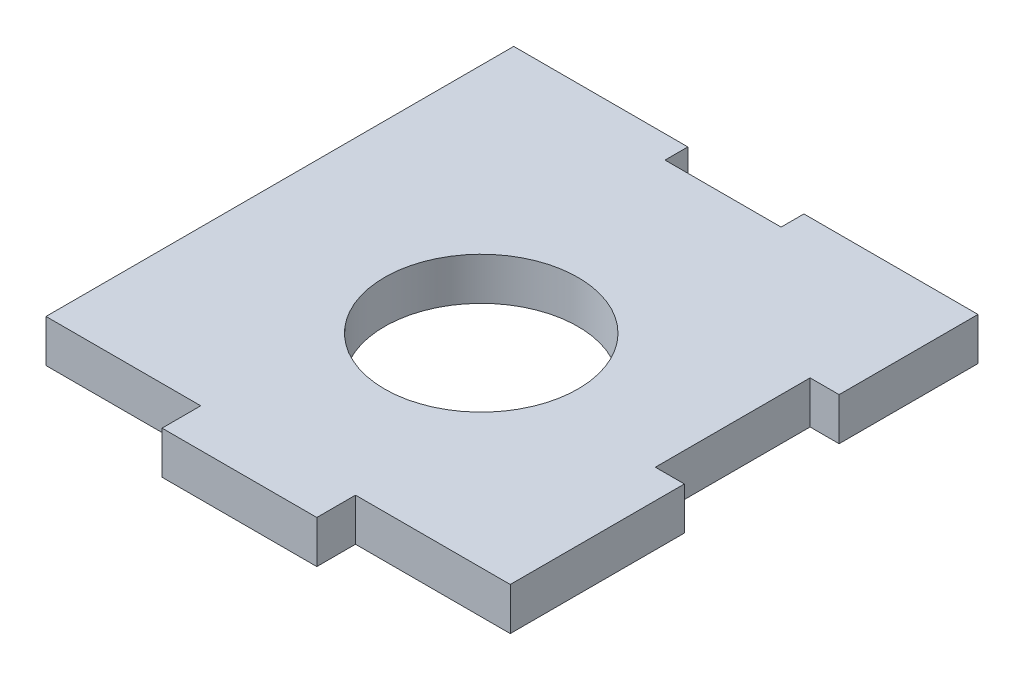
ISO-10303-21;
HEADER;
FILE_DESCRIPTION(('STEP AP214'),'2;1');
FILE_NAME('part.step','',(''),(''),'','','');
FILE_SCHEMA(('AUTOMOTIVE_DESIGN { 1 0 10303 214 1 1 1 1 }'));
ENDSEC;
DATA;
#1=APPLICATION_CONTEXT('core data for automotive mechanical design processes');
#2=APPLICATION_PROTOCOL_DEFINITION('international standard','automotive_design',2000,#1);
#3=PRODUCT_CONTEXT('',#1,'mechanical');
#4=PRODUCT('Part','Part','',(#3));
#5=PRODUCT_RELATED_PRODUCT_CATEGORY('part','',(#4));
#6=PRODUCT_DEFINITION_FORMATION('','',#4);
#7=PRODUCT_DEFINITION_CONTEXT('part definition',#1,'design');
#8=PRODUCT_DEFINITION('design','',#6,#7);
#9=PRODUCT_DEFINITION_SHAPE('','',#8);
#10=(LENGTH_UNIT() NAMED_UNIT(*) SI_UNIT(.MILLI.,.METRE.));
#11=(NAMED_UNIT(*) PLANE_ANGLE_UNIT() SI_UNIT($,.RADIAN.));
#12=(NAMED_UNIT(*) SI_UNIT($,.STERADIAN.) SOLID_ANGLE_UNIT());
#13=UNCERTAINTY_MEASURE_WITH_UNIT(LENGTH_MEASURE(1.E-05),#10,'distance_accuracy_value','');
#14=(GEOMETRIC_REPRESENTATION_CONTEXT(3) GLOBAL_UNCERTAINTY_ASSIGNED_CONTEXT((#13)) GLOBAL_UNIT_ASSIGNED_CONTEXT((#10,
#11,#12)) REPRESENTATION_CONTEXT('',''));
#15=CARTESIAN_POINT('',(0.,0.,0.));
#16=DIRECTION('',(0.,0.,1.));
#17=DIRECTION('',(1.,0.,0.));
#18=AXIS2_PLACEMENT_3D('',#15,#16,#17);
#19=CARTESIAN_POINT('',(0.,2.2,-30.3295211927794));
#20=DIRECTION('',(0.,0.,1.));
#21=DIRECTION('',(1.,0.,0.));
#22=AXIS2_PLACEMENT_3D('',#19,#20,#21);
#23=PLANE('',#22);
#24=DIRECTION('',(-1.,0.,0.));
#25=VECTOR('',#24,1.);
#26=CARTESIAN_POINT('',(0.,0.,-30.3295211927794));
#27=LINE('',#26,#25);
#28=CARTESIAN_POINT('',(-138.536383045774,0.,-30.3295211927794));
#29=VERTEX_POINT('',#28);
#30=CARTESIAN_POINT('',(-140.036383045781,0.,-30.3295211927794));
#31=VERTEX_POINT('',#30);
#32=EDGE_CURVE('E185',#29,#31,#27,.T.);
#33=ORIENTED_EDGE('',*,*,#32,.F.);
#34=DIRECTION('',(0.,-1.,0.));
#35=VECTOR('',#34,1.);
#36=CARTESIAN_POINT('',(-138.536383045774,2.2,-30.3295211927794));
#37=LINE('',#36,#35);
#38=CARTESIAN_POINT('',(-138.536383045774,2.2,-30.3295211927794));
#39=VERTEX_POINT('',#38);
#40=EDGE_CURVE('E11',#39,#29,#37,.T.);
#41=ORIENTED_EDGE('',*,*,#40,.F.);
#42=DIRECTION('',(-1.,0.,0.));
#43=VECTOR('',#42,1.);
#44=CARTESIAN_POINT('',(0.,2.2,-30.3295211927794));
#45=LINE('',#44,#43);
#46=CARTESIAN_POINT('',(-140.036383045781,2.2,-30.3295211927794));
#47=VERTEX_POINT('',#46);
#48=EDGE_CURVE('E274',#39,#47,#45,.T.);
#49=ORIENTED_EDGE('',*,*,#48,.T.);
#50=DIRECTION('',(0.,-1.,0.));
#51=VECTOR('',#50,1.);
#52=CARTESIAN_POINT('',(-140.036383045781,2.2,-30.3295211927794));
#53=LINE('',#52,#51);
#54=EDGE_CURVE('E54',#47,#31,#53,.T.);
#55=ORIENTED_EDGE('',*,*,#54,.T.);
#56=EDGE_LOOP('',(#33,#41,#49,#55));
#57=FACE_BOUND('',#56,.T.);
#58=ADVANCED_FACE('F37',(#57),#23,.T.);
#59=CARTESIAN_POINT('',(-138.536383045774,2.2,0.));
#60=DIRECTION('',(-1.,0.,0.));
#61=DIRECTION('',(0.,0.,1.));
#62=AXIS2_PLACEMENT_3D('',#59,#60,#61);
#63=PLANE('',#62);
#64=DIRECTION('',(0.,0.,-1.));
#65=VECTOR('',#64,1.);
#66=CARTESIAN_POINT('',(-138.536383045774,0.,0.));
#67=LINE('',#66,#65);
#68=CARTESIAN_POINT('',(-138.536383045774,0.,-37.5095211927366));
#69=VERTEX_POINT('',#68);
#70=EDGE_CURVE('E187',#29,#69,#67,.T.);
#71=ORIENTED_EDGE('',*,*,#70,.T.);
#72=DIRECTION('',(0.,-1.,0.));
#73=VECTOR('',#72,1.);
#74=CARTESIAN_POINT('',(-138.536383045774,2.2,-37.5095211927366));
#75=LINE('',#74,#73);
#76=CARTESIAN_POINT('',(-138.536383045774,2.2,-37.5095211927366));
#77=VERTEX_POINT('',#76);
#78=EDGE_CURVE('E46',#77,#69,#75,.T.);
#79=ORIENTED_EDGE('',*,*,#78,.F.);
#80=DIRECTION('',(0.,0.,-1.));
#81=VECTOR('',#80,1.);
#82=CARTESIAN_POINT('',(-138.536383045774,2.2,0.));
#83=LINE('',#82,#81);
#84=EDGE_CURVE('E165',#39,#77,#83,.T.);
#85=ORIENTED_EDGE('',*,*,#84,.F.);
#86=ORIENTED_EDGE('',*,*,#40,.T.);
#87=EDGE_LOOP('',(#71,#79,#85,#86));
#88=FACE_BOUND('',#87,.T.);
#89=ADVANCED_FACE('F261',(#88),#63,.F.);
#90=CARTESIAN_POINT('',(0.,2.2,-37.5095211927366));
#91=DIRECTION('',(0.,0.,-1.));
#92=DIRECTION('',(-1.,0.,0.));
#93=AXIS2_PLACEMENT_3D('',#90,#91,#92);
#94=PLANE('',#93);
#95=DIRECTION('',(1.,0.,0.));
#96=VECTOR('',#95,1.);
#97=CARTESIAN_POINT('',(0.,0.,-37.5095211927366));
#98=LINE('',#97,#96);
#99=CARTESIAN_POINT('',(-147.536383045791,0.,-37.5095211927366));
#100=VERTEX_POINT('',#99);
#101=EDGE_CURVE('E190',#100,#69,#98,.T.);
#102=ORIENTED_EDGE('',*,*,#101,.F.);
#103=DIRECTION('',(0.,-1.,0.));
#104=VECTOR('',#103,1.);
#105=CARTESIAN_POINT('',(-147.536383045791,2.2,-37.5095211927366));
#106=LINE('',#105,#104);
#107=CARTESIAN_POINT('',(-147.536383045791,2.2,-37.5095211927366));
#108=VERTEX_POINT('',#107);
#109=EDGE_CURVE('E251',#108,#100,#106,.T.);
#110=ORIENTED_EDGE('',*,*,#109,.F.);
#111=DIRECTION('',(1.,0.,0.));
#112=VECTOR('',#111,1.);
#113=CARTESIAN_POINT('',(0.,2.2,-37.5095211927366));
#114=LINE('',#113,#112);
#115=EDGE_CURVE('E258',#108,#77,#114,.T.);
#116=ORIENTED_EDGE('',*,*,#115,.T.);
#117=ORIENTED_EDGE('',*,*,#78,.T.);
#118=EDGE_LOOP('',(#102,#110,#116,#117));
#119=FACE_BOUND('',#118,.T.);
#120=ADVANCED_FACE('F256',(#119),#94,.T.);
#121=CARTESIAN_POINT('',(-147.536383045791,2.2,0.));
#122=DIRECTION('',(1.,0.,0.));
#123=DIRECTION('',(0.,0.,-1.));
#124=AXIS2_PLACEMENT_3D('',#121,#122,#123);
#125=PLANE('',#124);
#126=DIRECTION('',(0.,0.,1.));
#127=VECTOR('',#126,1.);
#128=CARTESIAN_POINT('',(-147.536383045791,0.,0.));
#129=LINE('',#128,#127);
#130=CARTESIAN_POINT('',(-147.536383045791,0.,-36.3295211926924));
#131=VERTEX_POINT('',#130);
#132=EDGE_CURVE('E193',#100,#131,#129,.T.);
#133=ORIENTED_EDGE('',*,*,#132,.T.);
#134=DIRECTION('',(0.,-1.,0.));
#135=VECTOR('',#134,1.);
#136=CARTESIAN_POINT('',(-147.536383045791,2.2,-36.3295211926924));
#137=LINE('',#136,#135);
#138=CARTESIAN_POINT('',(-147.536383045791,2.2,-36.3295211926924));
#139=VERTEX_POINT('',#138);
#140=EDGE_CURVE('E248',#139,#131,#137,.T.);
#141=ORIENTED_EDGE('',*,*,#140,.F.);
#142=DIRECTION('',(0.,0.,1.));
#143=VECTOR('',#142,1.);
#144=CARTESIAN_POINT('',(-147.536383045791,2.2,0.));
#145=LINE('',#144,#143);
#146=EDGE_CURVE('E270',#108,#139,#145,.T.);
#147=ORIENTED_EDGE('',*,*,#146,.F.);
#148=ORIENTED_EDGE('',*,*,#109,.T.);
#149=EDGE_LOOP('',(#133,#141,#147,#148));
#150=FACE_BOUND('',#149,.T.);
#151=ADVANCED_FACE('F267',(#150),#125,.F.);
#152=CARTESIAN_POINT('',(0.,2.2,-36.3295211926924));
#153=DIRECTION('',(0.,0.,1.));
#154=DIRECTION('',(1.,0.,0.));
#155=AXIS2_PLACEMENT_3D('',#152,#153,#154);
#156=PLANE('',#155);
#157=DIRECTION('',(-1.,0.,0.));
#158=VECTOR('',#157,1.);
#159=CARTESIAN_POINT('',(0.,0.,-36.3295211926924));
#160=LINE('',#159,#158);
#161=CARTESIAN_POINT('',(-153.536383045792,0.,-36.3295211926924));
#162=VERTEX_POINT('',#161);
#163=EDGE_CURVE('E196',#131,#162,#160,.T.);
#164=ORIENTED_EDGE('',*,*,#163,.T.);
#165=DIRECTION('',(0.,-1.,0.));
#166=VECTOR('',#165,1.);
#167=CARTESIAN_POINT('',(-153.536383045792,2.2,-36.3295211926924));
#168=LINE('',#167,#166);
#169=CARTESIAN_POINT('',(-153.536383045792,2.2,-36.3295211926924));
#170=VERTEX_POINT('',#169);
#171=EDGE_CURVE('E246',#170,#162,#168,.T.);
#172=ORIENTED_EDGE('',*,*,#171,.F.);
#173=DIRECTION('',(-1.,0.,0.));
#174=VECTOR('',#173,1.);
#175=CARTESIAN_POINT('',(0.,2.2,-36.3295211926924));
#176=LINE('',#175,#174);
#177=EDGE_CURVE('E271',#139,#170,#176,.T.);
#178=ORIENTED_EDGE('',*,*,#177,.F.);
#179=ORIENTED_EDGE('',*,*,#140,.T.);
#180=EDGE_LOOP('',(#164,#172,#178,#179));
#181=FACE_BOUND('',#180,.T.);
#182=ADVANCED_FACE('F323',(#181),#156,.F.);
#183=CARTESIAN_POINT('',(-153.536383045792,2.2,0.));
#184=DIRECTION('',(1.,0.,0.));
#185=DIRECTION('',(0.,0.,-1.));
#186=AXIS2_PLACEMENT_3D('',#183,#184,#185);
#187=PLANE('',#186);
#188=DIRECTION('',(0.,0.,1.));
#189=VECTOR('',#188,1.);
#190=CARTESIAN_POINT('',(-153.536383045792,0.,0.));
#191=LINE('',#190,#189);
#192=CARTESIAN_POINT('',(-153.536383045792,0.,-37.5095211927366));
#193=VERTEX_POINT('',#192);
#194=EDGE_CURVE('E199',#193,#162,#191,.T.);
#195=ORIENTED_EDGE('',*,*,#194,.F.);
#196=DIRECTION('',(0.,-1.,0.));
#197=VECTOR('',#196,1.);
#198=CARTESIAN_POINT('',(-153.536383045792,2.2,-37.5095211927366));
#199=LINE('',#198,#197);
#200=CARTESIAN_POINT('',(-153.536383045792,2.2,-37.5095211927366));
#201=VERTEX_POINT('',#200);
#202=EDGE_CURVE('E244',#201,#193,#199,.T.);
#203=ORIENTED_EDGE('',*,*,#202,.F.);
#204=DIRECTION('',(0.,0.,1.));
#205=VECTOR('',#204,1.);
#206=CARTESIAN_POINT('',(-153.536383045792,2.2,0.));
#207=LINE('',#206,#205);
#208=EDGE_CURVE('E278',#201,#170,#207,.T.);
#209=ORIENTED_EDGE('',*,*,#208,.T.);
#210=ORIENTED_EDGE('',*,*,#171,.T.);
#211=EDGE_LOOP('',(#195,#203,#209,#210));
#212=FACE_BOUND('',#211,.T.);
#213=ADVANCED_FACE('F326',(#212),#187,.T.);
#214=CARTESIAN_POINT('',(0.,2.2,-37.5095211927366));
#215=DIRECTION('',(0.,0.,-1.));
#216=DIRECTION('',(-1.,0.,0.));
#217=AXIS2_PLACEMENT_3D('',#214,#215,#216);
#218=PLANE('',#217);
#219=DIRECTION('',(1.,0.,0.));
#220=VECTOR('',#219,1.);
#221=CARTESIAN_POINT('',(0.,0.,-37.5095211927366));
#222=LINE('',#221,#220);
#223=CARTESIAN_POINT('',(-162.536383045789,0.,-37.5095211927366));
#224=VERTEX_POINT('',#223);
#225=EDGE_CURVE('E202',#224,#193,#222,.T.);
#226=ORIENTED_EDGE('',*,*,#225,.F.);
#227=DIRECTION('',(0.,-1.,0.));
#228=VECTOR('',#227,1.);
#229=CARTESIAN_POINT('',(-162.536383045789,2.2,-37.5095211927366));
#230=LINE('',#229,#228);
#231=CARTESIAN_POINT('',(-162.536383045789,2.2,-37.5095211927366));
#232=VERTEX_POINT('',#231);
#233=EDGE_CURVE('E242',#232,#224,#230,.T.);
#234=ORIENTED_EDGE('',*,*,#233,.F.);
#235=DIRECTION('',(1.,0.,0.));
#236=VECTOR('',#235,1.);
#237=CARTESIAN_POINT('',(0.,2.2,-37.5095211927366));
#238=LINE('',#237,#236);
#239=EDGE_CURVE('E281',#232,#201,#238,.T.);
#240=ORIENTED_EDGE('',*,*,#239,.T.);
#241=ORIENTED_EDGE('',*,*,#202,.T.);
#242=EDGE_LOOP('',(#226,#234,#240,#241));
#243=FACE_BOUND('',#242,.T.);
#244=ADVANCED_FACE('F330',(#243),#218,.T.);
#245=CARTESIAN_POINT('',(-162.536383045789,2.2,0.));
#246=DIRECTION('',(1.,0.,0.));
#247=DIRECTION('',(0.,0.,-1.));
#248=AXIS2_PLACEMENT_3D('',#245,#246,#247);
#249=PLANE('',#248);
#250=DIRECTION('',(0.,0.,1.));
#251=VECTOR('',#250,1.);
#252=CARTESIAN_POINT('',(-162.536383045789,0.,0.));
#253=LINE('',#252,#251);
#254=CARTESIAN_POINT('',(-162.536383045789,0.,-13.3295211927798));
#255=VERTEX_POINT('',#254);
#256=EDGE_CURVE('E205',#224,#255,#253,.T.);
#257=ORIENTED_EDGE('',*,*,#256,.T.);
#258=DIRECTION('',(0.,-1.,0.));
#259=VECTOR('',#258,1.);
#260=CARTESIAN_POINT('',(-162.536383045789,2.2,-13.3295211927798));
#261=LINE('',#260,#259);
#262=CARTESIAN_POINT('',(-162.536383045789,2.2,-13.3295211927798));
#263=VERTEX_POINT('',#262);
#264=EDGE_CURVE('E240',#263,#255,#261,.T.);
#265=ORIENTED_EDGE('',*,*,#264,.F.);
#266=DIRECTION('',(0.,0.,1.));
#267=VECTOR('',#266,1.);
#268=CARTESIAN_POINT('',(-162.536383045789,2.2,0.));
#269=LINE('',#268,#267);
#270=EDGE_CURVE('E284',#232,#263,#269,.T.);
#271=ORIENTED_EDGE('',*,*,#270,.F.);
#272=ORIENTED_EDGE('',*,*,#233,.T.);
#273=EDGE_LOOP('',(#257,#265,#271,#272));
#274=FACE_BOUND('',#273,.T.);
#275=ADVANCED_FACE('F334',(#274),#249,.F.);
#276=CARTESIAN_POINT('',(0.,2.2,-13.3295211927787));
#277=DIRECTION('',(0.,0.,1.));
#278=DIRECTION('',(1.,0.,0.));
#279=AXIS2_PLACEMENT_3D('',#276,#277,#278);
#280=PLANE('',#279);
#281=DIRECTION('',(-1.,0.,0.));
#282=VECTOR('',#281,1.);
#283=CARTESIAN_POINT('',(0.,0.,-13.3295211927787));
#284=LINE('',#283,#282);
#285=CARTESIAN_POINT('',(-154.536383045782,0.,-13.3295211927798));
#286=VERTEX_POINT('',#285);
#287=EDGE_CURVE('E208',#286,#255,#284,.T.);
#288=ORIENTED_EDGE('',*,*,#287,.F.);
#289=DIRECTION('',(0.,-1.,0.));
#290=VECTOR('',#289,1.);
#291=CARTESIAN_POINT('',(-154.536383045782,2.2,-13.3295211927798));
#292=LINE('',#291,#290);
#293=CARTESIAN_POINT('',(-154.536383045782,2.2,-13.3295211927798));
#294=VERTEX_POINT('',#293);
#295=EDGE_CURVE('E238',#294,#286,#292,.T.);
#296=ORIENTED_EDGE('',*,*,#295,.F.);
#297=DIRECTION('',(-1.,0.,0.));
#298=VECTOR('',#297,1.);
#299=CARTESIAN_POINT('',(0.,2.2,-13.3295211927787));
#300=LINE('',#299,#298);
#301=EDGE_CURVE('E286',#294,#263,#300,.T.);
#302=ORIENTED_EDGE('',*,*,#301,.T.);
#303=ORIENTED_EDGE('',*,*,#264,.T.);
#304=EDGE_LOOP('',(#288,#296,#302,#303));
#305=FACE_BOUND('',#304,.T.);
#306=ADVANCED_FACE('F338',(#305),#280,.T.);
#307=CARTESIAN_POINT('',(-154.536383045782,2.2,0.));
#308=DIRECTION('',(-1.,0.,0.));
#309=DIRECTION('',(0.,0.,1.));
#310=AXIS2_PLACEMENT_3D('',#307,#308,#309);
#311=PLANE('',#310);
#312=DIRECTION('',(0.,0.,-1.));
#313=VECTOR('',#312,1.);
#314=CARTESIAN_POINT('',(-154.536383045782,0.,0.));
#315=LINE('',#314,#313);
#316=CARTESIAN_POINT('',(-154.536383045782,0.,-11.3295211927732));
#317=VERTEX_POINT('',#316);
#318=EDGE_CURVE('E211',#317,#286,#315,.T.);
#319=ORIENTED_EDGE('',*,*,#318,.F.);
#320=DIRECTION('',(0.,-1.,0.));
#321=VECTOR('',#320,1.);
#322=CARTESIAN_POINT('',(-154.536383045782,2.2,-11.3295211927732));
#323=LINE('',#322,#321);
#324=CARTESIAN_POINT('',(-154.536383045782,2.2,-11.3295211927732));
#325=VERTEX_POINT('',#324);
#326=EDGE_CURVE('E236',#325,#317,#323,.T.);
#327=ORIENTED_EDGE('',*,*,#326,.F.);
#328=DIRECTION('',(0.,0.,-1.));
#329=VECTOR('',#328,1.);
#330=CARTESIAN_POINT('',(-154.536383045782,2.2,0.));
#331=LINE('',#330,#329);
#332=EDGE_CURVE('E289',#325,#294,#331,.T.);
#333=ORIENTED_EDGE('',*,*,#332,.T.);
#334=ORIENTED_EDGE('',*,*,#295,.T.);
#335=EDGE_LOOP('',(#319,#327,#333,#334));
#336=FACE_BOUND('',#335,.T.);
#337=ADVANCED_FACE('F342',(#336),#311,.T.);
#338=CARTESIAN_POINT('',(0.,2.2,-11.3295211927732));
#339=DIRECTION('',(0.,0.,1.));
#340=DIRECTION('',(1.,0.,0.));
#341=AXIS2_PLACEMENT_3D('',#338,#339,#340);
#342=PLANE('',#341);
#343=DIRECTION('',(-1.,0.,0.));
#344=VECTOR('',#343,1.);
#345=CARTESIAN_POINT('',(0.,0.,-11.3295211927732));
#346=LINE('',#345,#344);
#347=CARTESIAN_POINT('',(-146.536383045782,0.,-11.3295211927732));
#348=VERTEX_POINT('',#347);
#349=EDGE_CURVE('E214',#348,#317,#346,.T.);
#350=ORIENTED_EDGE('',*,*,#349,.F.);
#351=DIRECTION('',(0.,-1.,0.));
#352=VECTOR('',#351,1.);
#353=CARTESIAN_POINT('',(-146.536383045782,2.2,-11.3295211927732));
#354=LINE('',#353,#352);
#355=CARTESIAN_POINT('',(-146.536383045782,2.2,-11.3295211927732));
#356=VERTEX_POINT('',#355);
#357=EDGE_CURVE('E234',#356,#348,#354,.T.);
#358=ORIENTED_EDGE('',*,*,#357,.F.);
#359=DIRECTION('',(-1.,0.,0.));
#360=VECTOR('',#359,1.);
#361=CARTESIAN_POINT('',(0.,2.2,-11.3295211927732));
#362=LINE('',#361,#360);
#363=EDGE_CURVE('E292',#356,#325,#362,.T.);
#364=ORIENTED_EDGE('',*,*,#363,.T.);
#365=ORIENTED_EDGE('',*,*,#326,.T.);
#366=EDGE_LOOP('',(#350,#358,#364,#365));
#367=FACE_BOUND('',#366,.T.);
#368=ADVANCED_FACE('F346',(#367),#342,.T.);
#369=CARTESIAN_POINT('',(-146.536383045782,2.2,0.));
#370=DIRECTION('',(1.,0.,0.));
#371=DIRECTION('',(0.,0.,-1.));
#372=AXIS2_PLACEMENT_3D('',#369,#370,#371);
#373=PLANE('',#372);
#374=DIRECTION('',(0.,0.,1.));
#375=VECTOR('',#374,1.);
#376=CARTESIAN_POINT('',(-146.536383045782,0.,0.));
#377=LINE('',#376,#375);
#378=CARTESIAN_POINT('',(-146.536383045782,0.,-13.3295211927796));
#379=VERTEX_POINT('',#378);
#380=EDGE_CURVE('E217',#379,#348,#377,.T.);
#381=ORIENTED_EDGE('',*,*,#380,.F.);
#382=DIRECTION('',(0.,-1.,0.));
#383=VECTOR('',#382,1.);
#384=CARTESIAN_POINT('',(-146.536383045782,2.2,-13.3295211927796));
#385=LINE('',#384,#383);
#386=CARTESIAN_POINT('',(-146.536383045782,2.2,-13.3295211927796));
#387=VERTEX_POINT('',#386);
#388=EDGE_CURVE('E232',#387,#379,#385,.T.);
#389=ORIENTED_EDGE('',*,*,#388,.F.);
#390=DIRECTION('',(0.,0.,1.));
#391=VECTOR('',#390,1.);
#392=CARTESIAN_POINT('',(-146.536383045782,2.2,0.));
#393=LINE('',#392,#391);
#394=EDGE_CURVE('E294',#387,#356,#393,.T.);
#395=ORIENTED_EDGE('',*,*,#394,.T.);
#396=ORIENTED_EDGE('',*,*,#357,.T.);
#397=EDGE_LOOP('',(#381,#389,#395,#396));
#398=FACE_BOUND('',#397,.T.);
#399=ADVANCED_FACE('F350',(#398),#373,.T.);
#400=CARTESIAN_POINT('',(1.84984266693133E-13,2.2,-13.3295211927776));
#401=DIRECTION('',(0.,0.,1.));
#402=DIRECTION('',(1.,0.,0.));
#403=AXIS2_PLACEMENT_3D('',#400,#401,#402);
#404=PLANE('',#403);
#405=DIRECTION('',(-1.,0.,0.));
#406=VECTOR('',#405,1.);
#407=CARTESIAN_POINT('',(1.84984266693133E-13,0.,-13.3295211927776));
#408=LINE('',#407,#406);
#409=CARTESIAN_POINT('',(-138.536383045774,0.,-13.3295211927795));
#410=VERTEX_POINT('',#409);
#411=EDGE_CURVE('E220',#410,#379,#408,.T.);
#412=ORIENTED_EDGE('',*,*,#411,.F.);
#413=DIRECTION('',(0.,-1.,0.));
#414=VECTOR('',#413,1.);
#415=CARTESIAN_POINT('',(-138.536383045774,2.2,-13.3295211927795));
#416=LINE('',#415,#414);
#417=CARTESIAN_POINT('',(-138.536383045774,2.2,-13.3295211927795));
#418=VERTEX_POINT('',#417);
#419=EDGE_CURVE('E173',#418,#410,#416,.T.);
#420=ORIENTED_EDGE('',*,*,#419,.F.);
#421=DIRECTION('',(-1.,0.,0.));
#422=VECTOR('',#421,1.);
#423=CARTESIAN_POINT('',(1.84984266693133E-13,2.2,-13.3295211927776));
#424=LINE('',#423,#422);
#425=EDGE_CURVE('E162',#418,#387,#424,.T.);
#426=ORIENTED_EDGE('',*,*,#425,.T.);
#427=ORIENTED_EDGE('',*,*,#388,.T.);
#428=EDGE_LOOP('',(#412,#420,#426,#427));
#429=FACE_BOUND('',#428,.T.);
#430=ADVANCED_FACE('F299',(#429),#404,.T.);
#431=CARTESIAN_POINT('',(-138.536383045774,0.,-22.3295211927795));
#432=VERTEX_POINT('',#431);
#433=EDGE_CURVE('E170',#410,#432,#67,.T.);
#434=ORIENTED_EDGE('',*,*,#433,.T.);
#435=DIRECTION('',(0.,-1.,0.));
#436=VECTOR('',#435,1.);
#437=CARTESIAN_POINT('',(-138.536383045774,2.2,-22.3295211927795));
#438=LINE('',#437,#436);
#439=CARTESIAN_POINT('',(-138.536383045774,2.2,-22.3295211927795));
#440=VERTEX_POINT('',#439);
#441=EDGE_CURVE('E167',#440,#432,#438,.T.);
#442=ORIENTED_EDGE('',*,*,#441,.F.);
#443=EDGE_CURVE('E153',#418,#440,#83,.T.);
#444=ORIENTED_EDGE('',*,*,#443,.F.);
#445=ORIENTED_EDGE('',*,*,#419,.T.);
#446=EDGE_LOOP('',(#434,#442,#444,#445));
#447=FACE_BOUND('',#446,.T.);
#448=ADVANCED_FACE('F168',(#447),#63,.F.);
#449=CARTESIAN_POINT('',(0.,2.2,-22.3295211927795));
#450=DIRECTION('',(0.,0.,-1.));
#451=DIRECTION('',(-1.,0.,0.));
#452=AXIS2_PLACEMENT_3D('',#449,#450,#451);
#453=PLANE('',#452);
#454=DIRECTION('',(1.,0.,0.));
#455=VECTOR('',#454,1.);
#456=CARTESIAN_POINT('',(0.,0.,-22.3295211927795));
#457=LINE('',#456,#455);
#458=CARTESIAN_POINT('',(-140.036383045781,0.,-22.3295211927795));
#459=VERTEX_POINT('',#458);
#460=EDGE_CURVE('E223',#459,#432,#457,.T.);
#461=ORIENTED_EDGE('',*,*,#460,.F.);
#462=DIRECTION('',(0.,-1.,0.));
#463=VECTOR('',#462,1.);
#464=CARTESIAN_POINT('',(-140.036383045781,2.2,-22.3295211927795));
#465=LINE('',#464,#463);
#466=CARTESIAN_POINT('',(-140.036383045781,2.2,-22.3295211927795));
#467=VERTEX_POINT('',#466);
#468=EDGE_CURVE('E103',#467,#459,#465,.T.);
#469=ORIENTED_EDGE('',*,*,#468,.F.);
#470=DIRECTION('',(1.,0.,0.));
#471=VECTOR('',#470,1.);
#472=CARTESIAN_POINT('',(0.,2.2,-22.3295211927795));
#473=LINE('',#472,#471);
#474=EDGE_CURVE('E159',#467,#440,#473,.T.);
#475=ORIENTED_EDGE('',*,*,#474,.T.);
#476=ORIENTED_EDGE('',*,*,#441,.T.);
#477=EDGE_LOOP('',(#461,#469,#475,#476));
#478=FACE_BOUND('',#477,.T.);
#479=ADVANCED_FACE('F175',(#478),#453,.T.);
#480=CARTESIAN_POINT('',(-150.536383045771,2.2,-23.8295211927698));
#481=DIRECTION('',(0.,-1.,0.));
#482=DIRECTION('',(0.,0.,-1.));
#483=AXIS2_PLACEMENT_3D('',#480,#481,#482);
#484=CYLINDRICAL_SURFACE('',#483,5.00000000000005);
#485=CARTESIAN_POINT('',(-150.536383045771,2.2,-23.8295211927698));
#486=DIRECTION('',(0.,1.,0.));
#487=DIRECTION('',(0.,0.,1.));
#488=AXIS2_PLACEMENT_3D('',#485,#486,#487);
#489=CIRCLE('',#488,5.00000000000005);
#490=CARTESIAN_POINT('',(-150.536383045771,2.2,-18.8295211927697));
#491=VERTEX_POINT('',#490);
#492=EDGE_CURVE('E228',#491,#491,#489,.T.);
#493=ORIENTED_EDGE('',*,*,#492,.T.);
#494=EDGE_LOOP('',(#493));
#495=FACE_BOUND('',#494,.T.);
#496=CARTESIAN_POINT('',(-150.536383045771,0.,-23.8295211927698));
#497=DIRECTION('',(0.,1.,0.));
#498=DIRECTION('',(0.,0.,1.));
#499=AXIS2_PLACEMENT_3D('',#496,#497,#498);
#500=CIRCLE('',#499,5.00000000000005);
#501=CARTESIAN_POINT('',(-150.536383045771,0.,-18.8295211927697));
#502=VERTEX_POINT('',#501);
#503=EDGE_CURVE('E182',#502,#502,#500,.T.);
#504=ORIENTED_EDGE('',*,*,#503,.F.);
#505=EDGE_LOOP('',(#504));
#506=FACE_BOUND('',#505,.T.);
#507=ADVANCED_FACE('F39',(#495,#506),#484,.F.);
#508=CARTESIAN_POINT('',(-140.036383045782,2.2,-1.94339520928321E-12));
#509=DIRECTION('',(1.,0.,0.));
#510=DIRECTION('',(0.,0.,-1.));
#511=AXIS2_PLACEMENT_3D('',#508,#509,#510);
#512=PLANE('',#511);
#513=DIRECTION('',(0.,0.,1.));
#514=VECTOR('',#513,1.);
#515=CARTESIAN_POINT('',(-140.036383045782,0.,-1.94339520928321E-12));
#516=LINE('',#515,#514);
#517=EDGE_CURVE('E225',#31,#459,#516,.T.);
#518=ORIENTED_EDGE('',*,*,#517,.F.);
#519=ORIENTED_EDGE('',*,*,#54,.F.);
#520=DIRECTION('',(0.,0.,1.));
#521=VECTOR('',#520,1.);
#522=CARTESIAN_POINT('',(-140.036383045782,2.2,-1.94339520928321E-12));
#523=LINE('',#522,#521);
#524=EDGE_CURVE('E176',#47,#467,#523,.T.);
#525=ORIENTED_EDGE('',*,*,#524,.T.);
#526=ORIENTED_EDGE('',*,*,#468,.T.);
#527=EDGE_LOOP('',(#518,#519,#525,#526));
#528=FACE_BOUND('',#527,.T.);
#529=ADVANCED_FACE('F301',(#528),#512,.T.);
#530=CARTESIAN_POINT('',(0.,2.2,0.));
#531=DIRECTION('',(0.,1.,0.));
#532=DIRECTION('',(0.,0.,1.));
#533=AXIS2_PLACEMENT_3D('',#530,#531,#532);
#534=PLANE('',#533);
#535=ORIENTED_EDGE('',*,*,#492,.F.);
#536=EDGE_LOOP('',(#535));
#537=FACE_BOUND('',#536,.T.);
#538=ORIENTED_EDGE('',*,*,#48,.F.);
#539=ORIENTED_EDGE('',*,*,#84,.T.);
#540=ORIENTED_EDGE('',*,*,#115,.F.);
#541=ORIENTED_EDGE('',*,*,#146,.T.);
#542=ORIENTED_EDGE('',*,*,#177,.T.);
#543=ORIENTED_EDGE('',*,*,#208,.F.);
#544=ORIENTED_EDGE('',*,*,#239,.F.);
#545=ORIENTED_EDGE('',*,*,#270,.T.);
#546=ORIENTED_EDGE('',*,*,#301,.F.);
#547=ORIENTED_EDGE('',*,*,#332,.F.);
#548=ORIENTED_EDGE('',*,*,#363,.F.);
#549=ORIENTED_EDGE('',*,*,#394,.F.);
#550=ORIENTED_EDGE('',*,*,#425,.F.);
#551=ORIENTED_EDGE('',*,*,#443,.T.);
#552=ORIENTED_EDGE('',*,*,#474,.F.);
#553=ORIENTED_EDGE('',*,*,#524,.F.);
#554=EDGE_LOOP('',(#538,#539,#540,#541,#542,#543,#544,#545,#546,#547,#548,#549,#550,#551,#552,#553));
#555=FACE_BOUND('',#554,.T.);
#556=ADVANCED_FACE('F156',(#537,#555),#534,.T.);
#557=CARTESIAN_POINT('',(0.,0.,0.));
#558=DIRECTION('',(0.,1.,0.));
#559=DIRECTION('',(0.,0.,1.));
#560=AXIS2_PLACEMENT_3D('',#557,#558,#559);
#561=PLANE('',#560);
#562=ORIENTED_EDGE('',*,*,#503,.T.);
#563=EDGE_LOOP('',(#562));
#564=FACE_BOUND('',#563,.T.);
#565=ORIENTED_EDGE('',*,*,#32,.T.);
#566=ORIENTED_EDGE('',*,*,#517,.T.);
#567=ORIENTED_EDGE('',*,*,#460,.T.);
#568=ORIENTED_EDGE('',*,*,#433,.F.);
#569=ORIENTED_EDGE('',*,*,#411,.T.);
#570=ORIENTED_EDGE('',*,*,#380,.T.);
#571=ORIENTED_EDGE('',*,*,#349,.T.);
#572=ORIENTED_EDGE('',*,*,#318,.T.);
#573=ORIENTED_EDGE('',*,*,#287,.T.);
#574=ORIENTED_EDGE('',*,*,#256,.F.);
#575=ORIENTED_EDGE('',*,*,#225,.T.);
#576=ORIENTED_EDGE('',*,*,#194,.T.);
#577=ORIENTED_EDGE('',*,*,#163,.F.);
#578=ORIENTED_EDGE('',*,*,#132,.F.);
#579=ORIENTED_EDGE('',*,*,#101,.T.);
#580=ORIENTED_EDGE('',*,*,#70,.F.);
#581=EDGE_LOOP('',(#565,#566,#567,#568,#569,#570,#571,#572,#573,#574,#575,#576,#577,#578,#579,#580));
#582=FACE_BOUND('',#581,.T.);
#583=ADVANCED_FACE('F264',(#564,#582),#561,.F.);
#584=CLOSED_SHELL('',(#58,#89,#120,#151,#182,#213,#244,#275,#306,#337,#368,#399,#430,#448,#479,
#507,#529,#556,#583));
#585=MANIFOLD_SOLID_BREP('B2',#584);
#586=ADVANCED_BREP_SHAPE_REPRESENTATION('',(#18,#585),#14);
#587=SHAPE_DEFINITION_REPRESENTATION(#9,#586);
ENDSEC;
END-ISO-10303-21;
